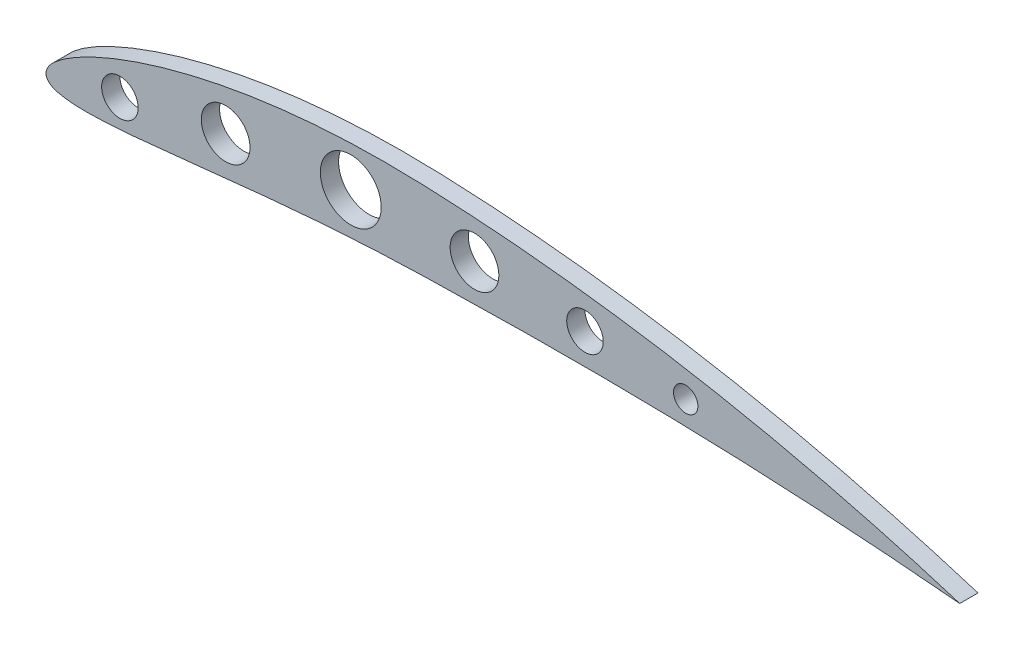
ISO-10303-21;
HEADER;
FILE_DESCRIPTION(('STEP AP214'),'2;1');
FILE_NAME('part.step','',(''),(''),'','','');
FILE_SCHEMA(('AUTOMOTIVE_DESIGN { 1 0 10303 214 1 1 1 1 }'));
ENDSEC;
DATA;
#1=APPLICATION_CONTEXT('core data for automotive mechanical design processes');
#2=APPLICATION_PROTOCOL_DEFINITION('international standard','automotive_design',2000,#1);
#3=PRODUCT_CONTEXT('',#1,'mechanical');
#4=PRODUCT('Part','Part','',(#3));
#5=PRODUCT_RELATED_PRODUCT_CATEGORY('part','',(#4));
#6=PRODUCT_DEFINITION_FORMATION('','',#4);
#7=PRODUCT_DEFINITION_CONTEXT('part definition',#1,'design');
#8=PRODUCT_DEFINITION('design','',#6,#7);
#9=PRODUCT_DEFINITION_SHAPE('','',#8);
#10=(LENGTH_UNIT() NAMED_UNIT(*) SI_UNIT(.MILLI.,.METRE.));
#11=(NAMED_UNIT(*) PLANE_ANGLE_UNIT() SI_UNIT($,.RADIAN.));
#12=(NAMED_UNIT(*) SI_UNIT($,.STERADIAN.) SOLID_ANGLE_UNIT());
#13=UNCERTAINTY_MEASURE_WITH_UNIT(LENGTH_MEASURE(1.E-05),#10,'distance_accuracy_value','');
#14=(GEOMETRIC_REPRESENTATION_CONTEXT(3) GLOBAL_UNCERTAINTY_ASSIGNED_CONTEXT((#13)) GLOBAL_UNIT_ASSIGNED_CONTEXT((#10,
#11,#12)) REPRESENTATION_CONTEXT('',''));
#15=CARTESIAN_POINT('',(0.,0.,0.));
#16=DIRECTION('',(0.,0.,1.));
#17=DIRECTION('',(1.,0.,0.));
#18=AXIS2_PLACEMENT_3D('',#15,#16,#17);
#19=CARTESIAN_POINT('',(0.868655213262158,2.19089135194776,3.));
#20=DIRECTION('',(0.,0.,-1.));
#21=DIRECTION('',(-1.,0.,0.));
#22=AXIS2_PLACEMENT_3D('',#19,#20,#21);
#23=PLANE('',#22);
#24=CARTESIAN_POINT('',(150.,0.,3.));
#25=CARTESIAN_POINT('',(150.003329288098,0.014662249381793,3.));
#26=CARTESIAN_POINT('',(149.134973150672,0.248896496606749,3.));
#27=CARTESIAN_POINT('',(148.258218064726,0.55673636161131,3.));
#28=CARTESIAN_POINT('',(146.092264589263,1.19654633017886,3.));
#29=CARTESIAN_POINT('',(143.419462383613,1.99778912742205,3.));
#30=CARTESIAN_POINT('',(139.8973824949,3.00503852710572,3.));
#31=CARTESIAN_POINT('',(135.708200057128,4.15404129208978,3.));
#32=CARTESIAN_POINT('',(130.840351884607,5.42023236841713,3.));
#33=CARTESIAN_POINT('',(125.358407530837,6.75391320255883,3.));
#34=CARTESIAN_POINT('',(119.317026459778,8.12073918287746,3.));
#35=CARTESIAN_POINT('',(112.776533721808,9.47315641929216,3.));
#36=CARTESIAN_POINT('',(105.8081891408,10.7735530552266,3.));
#37=CARTESIAN_POINT('',(98.4852742353414,11.9821183236793,3.));
#38=CARTESIAN_POINT('',(90.8867289870229,13.0634556553686,3.));
#39=CARTESIAN_POINT('',(83.0963164113784,13.987889126777,3.));
#40=CARTESIAN_POINT('',(75.2008775632585,14.7296564652224,3.));
#41=CARTESIAN_POINT('',(67.2867045416149,15.2583026600307,3.));
#42=CARTESIAN_POINT('',(59.4020917517364,15.5949352264237,3.));
#43=CARTESIAN_POINT('',(51.630745923189,15.5985104910385,3.));
#44=CARTESIAN_POINT('',(44.0772108290214,15.1999156905343,3.));
#45=CARTESIAN_POINT('',(36.8788402768822,14.4541881360431,3.));
#46=CARTESIAN_POINT('',(30.1283124778648,13.3973016279451,3.));
#47=CARTESIAN_POINT('',(23.9108028217145,12.0836838142789,3.));
#48=CARTESIAN_POINT('',(18.3002624953933,10.5812507246044,3.));
#49=CARTESIAN_POINT('',(13.3638162704224,8.95525486581491,3.));
#50=CARTESIAN_POINT('',(9.15203164401697,7.28566296549237,3.));
#51=CARTESIAN_POINT('',(5.71179711056867,5.62797186627232,3.));
#52=CARTESIAN_POINT('',(3.05382609046227,4.06651589033411,3.));
#53=CARTESIAN_POINT('',(1.21164919063601,2.6132969274779,3.));
#54=CARTESIAN_POINT('',(0.085052112339767,1.33763685976724,3.));
#55=CARTESIAN_POINT('',(-0.180458674317127,-0.0525224950474071,3.));
#56=CARTESIAN_POINT('',(0.796524923320563,-1.07046827432894,3.));
#57=CARTESIAN_POINT('',(2.41295725296556,-1.53139163258686,3.));
#58=CARTESIAN_POINT('',(4.69512828229199,-1.80071088142852,3.));
#59=CARTESIAN_POINT('',(7.68815207852203,-1.81332682765504,3.));
#60=CARTESIAN_POINT('',(11.3620652219487,-1.62868851947792,3.));
#61=CARTESIAN_POINT('',(15.6799913776274,-1.26019933249983,3.));
#62=CARTESIAN_POINT('',(20.592376906984,-0.755998832845897,3.));
#63=CARTESIAN_POINT('',(26.0492057680031,-0.159719017170101,3.));
#64=CARTESIAN_POINT('',(31.9923782717827,0.483630714989271,3.));
#65=CARTESIAN_POINT('',(38.3681705496154,1.12082265392437,3.));
#66=CARTESIAN_POINT('',(45.1151729753294,1.69616204750979,3.));
#67=CARTESIAN_POINT('',(52.1753974691805,2.17132127896637,3.));
#68=CARTESIAN_POINT('',(59.5252685150396,2.4861103560316,3.));
#69=CARTESIAN_POINT('',(67.096034109242,2.66254785129545,3.));
#70=CARTESIAN_POINT('',(74.8069470177635,2.81955224948347,3.));
#71=CARTESIAN_POINT('',(82.5372963529707,2.89928914122949,3.));
#72=CARTESIAN_POINT('',(90.2001718911497,2.9073914753727,3.));
#73=CARTESIAN_POINT('',(97.7131039294619,2.83440001624777,3.));
#74=CARTESIAN_POINT('',(104.993995582754,2.68571683811821,3.));
#75=CARTESIAN_POINT('',(111.962787733179,2.46721579099941,3.));
#76=CARTESIAN_POINT('',(118.541868922386,2.19416658208878,3.));
#77=CARTESIAN_POINT('',(124.65666734329,1.87970597556436,3.));
#78=CARTESIAN_POINT('',(130.234494892084,1.5455926932117,3.));
#79=CARTESIAN_POINT('',(135.216199769319,1.20653216079122,3.));
#80=CARTESIAN_POINT('',(139.523505248161,0.887469492673937,3.));
#81=CARTESIAN_POINT('',(143.160651508115,0.594190169675158,3.));
#82=CARTESIAN_POINT('',(145.933395979494,0.365370935003347,3.));
#83=CARTESIAN_POINT('',(148.178013553918,0.152677435659765,3.));
#84=CARTESIAN_POINT('',(149.106467306683,0.10166923520628,3.));
#85=CARTESIAN_POINT('',(149.996691266853,-0.0145717249786521,3.));
#86=CARTESIAN_POINT('',(150.,0.,3.));
#87=B_SPLINE_CURVE_WITH_KNOTS('',3,(#24,#25,#26,#27,#28,#29,#30,#31,#32,#33,#34,#35,#36,#37,#38,
#39,#40,#41,#42,#43,#44,#45,#46,#47,#48,#49,#50,#51,#52,#53,#54,#55,#56,#57,#58,#59,#60,#61,#62,
#63,#64,#65,#66,#67,#68,#69,#70,#71,#72,#73,#74,#75,#76,#77,#78,#79,#80,#81,#82,#83,#84,#85,
#86),.UNSPECIFIED.,.T.,.F.,(4,1,1,1,1,1,1,1,1,1,1,1,1,1,1,1,1,1,1,1,1,1,1,1,1,1,1,1,1,1,1,1,1,1,
1,1,1,1,1,1,1,1,1,1,1,1,1,1,1,1,1,1,1,1,1,1,1,1,1,1,4),(0.,0.00137455348322322,
0.00548449728179397,0.0122733609908926,0.021682195504866,0.0335806119079947,0.0478307427867091,
0.0643059527211733,0.082777332043007,0.103063756455996,0.124929016786915,0.148149110667858,
0.172444694611559,0.197572105868171,0.223268880537162,0.249227774933554,0.275186209349679,
0.300900708934774,0.326462938278696,0.351222485186767,0.374905858971967,0.397269706218862,
0.418072413969665,0.437079533175026,0.454093093767394,0.468919631578705,0.48139171235289,
0.491447126518174,0.499023571234558,0.504293734329401,0.507921918342,0.511539686153778,
0.516780527527172,0.524216490268905,0.533991629403711,0.546033957270731,0.560220284382465,
0.576403357410148,0.594370816485922,0.613951103581465,0.634916884969972,0.657088503485649,
0.680229909573905,0.704175481107386,0.729090367406641,0.754353775526936,0.779667752347888,
0.804760119952374,0.829359338708985,0.853208710008459,0.876041363199166,0.897604065496152,
0.917662212410958,0.935969860405553,0.952309787739252,0.966502759006892,0.978350082728452,
0.987731492337842,0.994510920242662,0.998633932979557,1.),.UNSPECIFIED.);
#88=CARTESIAN_POINT('',(150.,0.,3.));
#89=VERTEX_POINT('',#88);
#90=EDGE_CURVE('E11',#89,#89,#87,.T.);
#91=ORIENTED_EDGE('',*,*,#90,.T.);
#92=EDGE_LOOP('',(#91));
#93=FACE_BOUND('',#92,.T.);
#94=CARTESIAN_POINT('',(50.,8.83483874764579,3.));
#95=DIRECTION('',(0.,0.,1.));
#96=DIRECTION('',(1.,0.,0.));
#97=AXIS2_PLACEMENT_3D('',#94,#95,#96);
#98=CIRCLE('',#97,5.);
#99=CARTESIAN_POINT('',(55.,8.83483874764579,3.));
#100=VERTEX_POINT('',#99);
#101=EDGE_CURVE('E53',#100,#100,#98,.T.);
#102=ORIENTED_EDGE('',*,*,#101,.F.);
#103=EDGE_LOOP('',(#102));
#104=FACE_BOUND('',#103,.T.);
#105=CARTESIAN_POINT('',(105.,6.55662819325187,3.));
#106=DIRECTION('',(0.,0.,1.));
#107=DIRECTION('',(1.,0.,0.));
#108=AXIS2_PLACEMENT_3D('',#105,#106,#107);
#109=CIRCLE('',#108,2.);
#110=CARTESIAN_POINT('',(107.,6.55662819325187,3.));
#111=VERTEX_POINT('',#110);
#112=EDGE_CURVE('E76',#111,#111,#109,.T.);
#113=ORIENTED_EDGE('',*,*,#112,.F.);
#114=EDGE_LOOP('',(#113));
#115=FACE_BOUND('',#114,.T.);
#116=CARTESIAN_POINT('',(70.3168159356622,8.83483874764579,3.));
#117=DIRECTION('',(0.,0.,1.));
#118=DIRECTION('',(1.,0.,0.));
#119=AXIS2_PLACEMENT_3D('',#116,#117,#118);
#120=CIRCLE('',#119,4.00000000000001);
#121=CARTESIAN_POINT('',(74.3168159356622,8.83483874764579,3.));
#122=VERTEX_POINT('',#121);
#123=EDGE_CURVE('E77',#122,#122,#120,.T.);
#124=ORIENTED_EDGE('',*,*,#123,.F.);
#125=EDGE_LOOP('',(#124));
#126=FACE_BOUND('',#125,.T.);
#127=CARTESIAN_POINT('',(29.4551005586143,6.55662819325187,3.));
#128=DIRECTION('',(0.,0.,1.));
#129=DIRECTION('',(1.,0.,0.));
#130=AXIS2_PLACEMENT_3D('',#127,#128,#129);
#131=CIRCLE('',#130,4.);
#132=CARTESIAN_POINT('',(33.4551005586143,6.55662819325187,3.));
#133=VERTEX_POINT('',#132);
#134=EDGE_CURVE('E86',#133,#133,#131,.T.);
#135=ORIENTED_EDGE('',*,*,#134,.F.);
#136=EDGE_LOOP('',(#135));
#137=FACE_BOUND('',#136,.T.);
#138=CARTESIAN_POINT('',(12.0879348632954,3.04049328422451,3.));
#139=DIRECTION('',(0.,0.,1.));
#140=DIRECTION('',(1.,0.,0.));
#141=AXIS2_PLACEMENT_3D('',#138,#139,#140);
#142=CIRCLE('',#141,3.);
#143=CARTESIAN_POINT('',(15.0879348632954,3.04049328422451,3.));
#144=VERTEX_POINT('',#143);
#145=EDGE_CURVE('E102',#144,#144,#142,.T.);
#146=ORIENTED_EDGE('',*,*,#145,.F.);
#147=EDGE_LOOP('',(#146));
#148=FACE_BOUND('',#147,.T.);
#149=CARTESIAN_POINT('',(88.4595854656354,7.95328440218412,3.));
#150=DIRECTION('',(0.,0.,1.));
#151=DIRECTION('',(1.,0.,0.));
#152=AXIS2_PLACEMENT_3D('',#149,#150,#151);
#153=CIRCLE('',#152,3.00000000000001);
#154=CARTESIAN_POINT('',(91.4595854656354,7.95328440218412,3.));
#155=VERTEX_POINT('',#154);
#156=EDGE_CURVE('E103',#155,#155,#153,.T.);
#157=ORIENTED_EDGE('',*,*,#156,.F.);
#158=EDGE_LOOP('',(#157));
#159=FACE_BOUND('',#158,.T.);
#160=ADVANCED_FACE('F38',(#93,#104,#115,#126,#137,#148,#159),#23,.F.);
#161=CARTESIAN_POINT('',(0.868655213262158,2.19089135194776,0.));
#162=DIRECTION('',(0.,0.,-1.));
#163=DIRECTION('',(-1.,0.,0.));
#164=AXIS2_PLACEMENT_3D('',#161,#162,#163);
#165=PLANE('',#164);
#166=CARTESIAN_POINT('',(12.0879348632954,3.04049328422451,0.));
#167=DIRECTION('',(0.,0.,1.));
#168=DIRECTION('',(1.,0.,0.));
#169=AXIS2_PLACEMENT_3D('',#166,#167,#168);
#170=CIRCLE('',#169,3.);
#171=CARTESIAN_POINT('',(15.0879348632954,3.04049328422451,0.));
#172=VERTEX_POINT('',#171);
#173=EDGE_CURVE('E99',#172,#172,#170,.T.);
#174=ORIENTED_EDGE('',*,*,#173,.T.);
#175=EDGE_LOOP('',(#174));
#176=FACE_BOUND('',#175,.T.);
#177=CARTESIAN_POINT('',(70.3168159356622,8.83483874764579,0.));
#178=DIRECTION('',(0.,0.,1.));
#179=DIRECTION('',(1.,0.,0.));
#180=AXIS2_PLACEMENT_3D('',#177,#178,#179);
#181=CIRCLE('',#180,4.00000000000001);
#182=CARTESIAN_POINT('',(74.3168159356622,8.83483874764579,0.));
#183=VERTEX_POINT('',#182);
#184=EDGE_CURVE('E82',#183,#183,#181,.T.);
#185=ORIENTED_EDGE('',*,*,#184,.T.);
#186=EDGE_LOOP('',(#185));
#187=FACE_BOUND('',#186,.T.);
#188=CARTESIAN_POINT('',(50.,8.83483874764579,0.));
#189=DIRECTION('',(0.,0.,1.));
#190=DIRECTION('',(1.,0.,0.));
#191=AXIS2_PLACEMENT_3D('',#188,#189,#190);
#192=CIRCLE('',#191,5.);
#193=CARTESIAN_POINT('',(55.,8.83483874764579,0.));
#194=VERTEX_POINT('',#193);
#195=EDGE_CURVE('E58',#194,#194,#192,.T.);
#196=ORIENTED_EDGE('',*,*,#195,.T.);
#197=EDGE_LOOP('',(#196));
#198=FACE_BOUND('',#197,.T.);
#199=CARTESIAN_POINT('',(150.,0.,0.));
#200=CARTESIAN_POINT('',(150.003329288098,0.014662249381793,0.));
#201=CARTESIAN_POINT('',(149.134973150672,0.248896496606749,0.));
#202=CARTESIAN_POINT('',(148.258218064726,0.55673636161131,0.));
#203=CARTESIAN_POINT('',(146.092264589263,1.19654633017886,0.));
#204=CARTESIAN_POINT('',(143.419462383613,1.99778912742205,0.));
#205=CARTESIAN_POINT('',(139.8973824949,3.00503852710572,0.));
#206=CARTESIAN_POINT('',(135.708200057128,4.15404129208978,0.));
#207=CARTESIAN_POINT('',(130.840351884607,5.42023236841713,0.));
#208=CARTESIAN_POINT('',(125.358407530837,6.75391320255883,0.));
#209=CARTESIAN_POINT('',(119.317026459778,8.12073918287746,0.));
#210=CARTESIAN_POINT('',(112.776533721808,9.47315641929216,0.));
#211=CARTESIAN_POINT('',(105.8081891408,10.7735530552266,0.));
#212=CARTESIAN_POINT('',(98.4852742353414,11.9821183236793,0.));
#213=CARTESIAN_POINT('',(90.8867289870229,13.0634556553686,0.));
#214=CARTESIAN_POINT('',(83.0963164113784,13.987889126777,0.));
#215=CARTESIAN_POINT('',(75.2008775632585,14.7296564652224,0.));
#216=CARTESIAN_POINT('',(67.2867045416149,15.2583026600307,0.));
#217=CARTESIAN_POINT('',(59.4020917517364,15.5949352264237,0.));
#218=CARTESIAN_POINT('',(51.630745923189,15.5985104910385,0.));
#219=CARTESIAN_POINT('',(44.0772108290214,15.1999156905343,0.));
#220=CARTESIAN_POINT('',(36.8788402768822,14.4541881360431,0.));
#221=CARTESIAN_POINT('',(30.1283124778648,13.3973016279451,0.));
#222=CARTESIAN_POINT('',(23.9108028217145,12.0836838142789,0.));
#223=CARTESIAN_POINT('',(18.3002624953933,10.5812507246044,0.));
#224=CARTESIAN_POINT('',(13.3638162704224,8.95525486581491,0.));
#225=CARTESIAN_POINT('',(9.15203164401697,7.28566296549237,0.));
#226=CARTESIAN_POINT('',(5.71179711056867,5.62797186627232,0.));
#227=CARTESIAN_POINT('',(3.05382609046227,4.06651589033411,0.));
#228=CARTESIAN_POINT('',(1.21164919063601,2.6132969274779,0.));
#229=CARTESIAN_POINT('',(0.085052112339767,1.33763685976724,0.));
#230=CARTESIAN_POINT('',(-0.180458674317127,-0.0525224950474071,0.));
#231=CARTESIAN_POINT('',(0.796524923320563,-1.07046827432894,0.));
#232=CARTESIAN_POINT('',(2.41295725296556,-1.53139163258686,0.));
#233=CARTESIAN_POINT('',(4.69512828229199,-1.80071088142852,0.));
#234=CARTESIAN_POINT('',(7.68815207852203,-1.81332682765504,0.));
#235=CARTESIAN_POINT('',(11.3620652219487,-1.62868851947792,0.));
#236=CARTESIAN_POINT('',(15.6799913776274,-1.26019933249983,0.));
#237=CARTESIAN_POINT('',(20.592376906984,-0.755998832845897,0.));
#238=CARTESIAN_POINT('',(26.0492057680031,-0.159719017170101,0.));
#239=CARTESIAN_POINT('',(31.9923782717827,0.483630714989271,0.));
#240=CARTESIAN_POINT('',(38.3681705496154,1.12082265392437,0.));
#241=CARTESIAN_POINT('',(45.1151729753294,1.69616204750979,0.));
#242=CARTESIAN_POINT('',(52.1753974691805,2.17132127896637,0.));
#243=CARTESIAN_POINT('',(59.5252685150396,2.4861103560316,0.));
#244=CARTESIAN_POINT('',(67.096034109242,2.66254785129545,0.));
#245=CARTESIAN_POINT('',(74.8069470177635,2.81955224948347,0.));
#246=CARTESIAN_POINT('',(82.5372963529707,2.89928914122949,0.));
#247=CARTESIAN_POINT('',(90.2001718911497,2.9073914753727,0.));
#248=CARTESIAN_POINT('',(97.7131039294619,2.83440001624777,0.));
#249=CARTESIAN_POINT('',(104.993995582754,2.68571683811821,0.));
#250=CARTESIAN_POINT('',(111.962787733179,2.46721579099941,0.));
#251=CARTESIAN_POINT('',(118.541868922386,2.19416658208878,0.));
#252=CARTESIAN_POINT('',(124.65666734329,1.87970597556436,0.));
#253=CARTESIAN_POINT('',(130.234494892084,1.5455926932117,0.));
#254=CARTESIAN_POINT('',(135.216199769319,1.20653216079122,0.));
#255=CARTESIAN_POINT('',(139.523505248161,0.887469492673937,0.));
#256=CARTESIAN_POINT('',(143.160651508115,0.594190169675158,0.));
#257=CARTESIAN_POINT('',(145.933395979494,0.365370935003347,0.));
#258=CARTESIAN_POINT('',(148.178013553918,0.152677435659765,0.));
#259=CARTESIAN_POINT('',(149.106467306683,0.10166923520628,0.));
#260=CARTESIAN_POINT('',(149.996691266853,-0.0145717249786521,0.));
#261=CARTESIAN_POINT('',(150.,0.,0.));
#262=B_SPLINE_CURVE_WITH_KNOTS('',3,(#199,#200,#201,#202,#203,#204,#205,#206,#207,#208,#209,
#210,#211,#212,#213,#214,#215,#216,#217,#218,#219,#220,#221,#222,#223,#224,#225,#226,#227,#228,
#229,#230,#231,#232,#233,#234,#235,#236,#237,#238,#239,#240,#241,#242,#243,#244,#245,#246,#247,
#248,#249,#250,#251,#252,#253,#254,#255,#256,#257,#258,#259,#260,#261),.UNSPECIFIED.,.T.,.F.,(4,
1,1,1,1,1,1,1,1,1,1,1,1,1,1,1,1,1,1,1,1,1,1,1,1,1,1,1,1,1,1,1,1,1,1,1,1,1,1,1,1,1,1,1,1,1,1,1,1,
1,1,1,1,1,1,1,1,1,1,1,4),(0.,0.00137455348322322,0.00548449728179397,0.0122733609908926,
0.021682195504866,0.0335806119079947,0.0478307427867091,0.0643059527211733,0.082777332043007,
0.103063756455996,0.124929016786915,0.148149110667858,0.172444694611559,0.197572105868171,
0.223268880537162,0.249227774933554,0.275186209349679,0.300900708934774,0.326462938278696,
0.351222485186767,0.374905858971967,0.397269706218862,0.418072413969665,0.437079533175026,
0.454093093767394,0.468919631578705,0.48139171235289,0.491447126518174,0.499023571234558,
0.504293734329401,0.507921918342,0.511539686153778,0.516780527527172,0.524216490268905,
0.533991629403711,0.546033957270731,0.560220284382465,0.576403357410148,0.594370816485922,
0.613951103581465,0.634916884969972,0.657088503485649,0.680229909573905,0.704175481107386,
0.729090367406641,0.754353775526936,0.779667752347888,0.804760119952374,0.829359338708985,
0.853208710008459,0.876041363199166,0.897604065496152,0.917662212410958,0.935969860405553,
0.952309787739252,0.966502759006892,0.978350082728452,0.987731492337842,0.994510920242662,
0.998633932979557,1.),.UNSPECIFIED.);
#263=CARTESIAN_POINT('',(150.,0.,0.));
#264=VERTEX_POINT('',#263);
#265=EDGE_CURVE('E43',#264,#264,#262,.T.);
#266=ORIENTED_EDGE('',*,*,#265,.F.);
#267=EDGE_LOOP('',(#266));
#268=FACE_BOUND('',#267,.T.);
#269=CARTESIAN_POINT('',(105.,6.55662819325187,0.));
#270=DIRECTION('',(0.,0.,1.));
#271=DIRECTION('',(1.,0.,0.));
#272=AXIS2_PLACEMENT_3D('',#269,#270,#271);
#273=CIRCLE('',#272,2.);
#274=CARTESIAN_POINT('',(107.,6.55662819325187,0.));
#275=VERTEX_POINT('',#274);
#276=EDGE_CURVE('E73',#275,#275,#273,.T.);
#277=ORIENTED_EDGE('',*,*,#276,.T.);
#278=EDGE_LOOP('',(#277));
#279=FACE_BOUND('',#278,.T.);
#280=CARTESIAN_POINT('',(29.4551005586143,6.55662819325187,0.));
#281=DIRECTION('',(0.,0.,1.));
#282=DIRECTION('',(1.,0.,0.));
#283=AXIS2_PLACEMENT_3D('',#280,#281,#282);
#284=CIRCLE('',#283,4.);
#285=CARTESIAN_POINT('',(33.4551005586143,6.55662819325187,0.));
#286=VERTEX_POINT('',#285);
#287=EDGE_CURVE('E91',#286,#286,#284,.T.);
#288=ORIENTED_EDGE('',*,*,#287,.T.);
#289=EDGE_LOOP('',(#288));
#290=FACE_BOUND('',#289,.T.);
#291=CARTESIAN_POINT('',(88.4595854656354,7.95328440218412,0.));
#292=DIRECTION('',(0.,0.,1.));
#293=DIRECTION('',(1.,0.,0.));
#294=AXIS2_PLACEMENT_3D('',#291,#292,#293);
#295=CIRCLE('',#294,3.00000000000001);
#296=CARTESIAN_POINT('',(91.4595854656354,7.95328440218412,0.));
#297=VERTEX_POINT('',#296);
#298=EDGE_CURVE('E108',#297,#297,#295,.T.);
#299=ORIENTED_EDGE('',*,*,#298,.T.);
#300=EDGE_LOOP('',(#299));
#301=FACE_BOUND('',#300,.T.);
#302=ADVANCED_FACE('F120',(#176,#187,#198,#268,#279,#290,#301),#165,.T.);
#303=DIRECTION('',(0.,0.,-1.));
#304=VECTOR('',#303,1.);
#305=SURFACE_OF_LINEAR_EXTRUSION('',#87,#304);
#306=ORIENTED_EDGE('',*,*,#90,.F.);
#307=EDGE_LOOP('',(#306));
#308=FACE_BOUND('',#307,.T.);
#309=ORIENTED_EDGE('',*,*,#265,.T.);
#310=EDGE_LOOP('',(#309));
#311=FACE_BOUND('',#310,.T.);
#312=ADVANCED_FACE('F40',(#308,#311),#305,.F.);
#313=CARTESIAN_POINT('',(50.,8.83483874764579,3.));
#314=DIRECTION('',(0.,0.,-1.));
#315=DIRECTION('',(-1.,0.,0.));
#316=AXIS2_PLACEMENT_3D('',#313,#314,#315);
#317=CYLINDRICAL_SURFACE('',#316,5.);
#318=ORIENTED_EDGE('',*,*,#101,.T.);
#319=EDGE_LOOP('',(#318));
#320=FACE_BOUND('',#319,.T.);
#321=ORIENTED_EDGE('',*,*,#195,.F.);
#322=EDGE_LOOP('',(#321));
#323=FACE_BOUND('',#322,.T.);
#324=ADVANCED_FACE('F128',(#320,#323),#317,.F.);
#325=CARTESIAN_POINT('',(105.,6.55662819325187,3.));
#326=DIRECTION('',(0.,0.,-1.));
#327=DIRECTION('',(-1.,0.,0.));
#328=AXIS2_PLACEMENT_3D('',#325,#326,#327);
#329=CYLINDRICAL_SURFACE('',#328,2.);
#330=ORIENTED_EDGE('',*,*,#112,.T.);
#331=EDGE_LOOP('',(#330));
#332=FACE_BOUND('',#331,.T.);
#333=ORIENTED_EDGE('',*,*,#276,.F.);
#334=EDGE_LOOP('',(#333));
#335=FACE_BOUND('',#334,.T.);
#336=ADVANCED_FACE('F131',(#332,#335),#329,.F.);
#337=CARTESIAN_POINT('',(70.3168159356622,8.83483874764579,3.));
#338=DIRECTION('',(0.,0.,-1.));
#339=DIRECTION('',(-1.,0.,0.));
#340=AXIS2_PLACEMENT_3D('',#337,#338,#339);
#341=CYLINDRICAL_SURFACE('',#340,4.00000000000001);
#342=ORIENTED_EDGE('',*,*,#123,.T.);
#343=EDGE_LOOP('',(#342));
#344=FACE_BOUND('',#343,.T.);
#345=ORIENTED_EDGE('',*,*,#184,.F.);
#346=EDGE_LOOP('',(#345));
#347=FACE_BOUND('',#346,.T.);
#348=ADVANCED_FACE('F135',(#344,#347),#341,.F.);
#349=CARTESIAN_POINT('',(29.4551005586143,6.55662819325187,3.));
#350=DIRECTION('',(0.,0.,-1.));
#351=DIRECTION('',(-1.,0.,0.));
#352=AXIS2_PLACEMENT_3D('',#349,#350,#351);
#353=CYLINDRICAL_SURFACE('',#352,4.);
#354=ORIENTED_EDGE('',*,*,#134,.T.);
#355=EDGE_LOOP('',(#354));
#356=FACE_BOUND('',#355,.T.);
#357=ORIENTED_EDGE('',*,*,#287,.F.);
#358=EDGE_LOOP('',(#357));
#359=FACE_BOUND('',#358,.T.);
#360=ADVANCED_FACE('F139',(#356,#359),#353,.F.);
#361=CARTESIAN_POINT('',(12.0879348632954,3.04049328422451,3.));
#362=DIRECTION('',(0.,0.,-1.));
#363=DIRECTION('',(-1.,0.,0.));
#364=AXIS2_PLACEMENT_3D('',#361,#362,#363);
#365=CYLINDRICAL_SURFACE('',#364,3.);
#366=ORIENTED_EDGE('',*,*,#145,.T.);
#367=EDGE_LOOP('',(#366));
#368=FACE_BOUND('',#367,.T.);
#369=ORIENTED_EDGE('',*,*,#173,.F.);
#370=EDGE_LOOP('',(#369));
#371=FACE_BOUND('',#370,.T.);
#372=ADVANCED_FACE('F143',(#368,#371),#365,.F.);
#373=CARTESIAN_POINT('',(88.4595854656354,7.95328440218412,3.));
#374=DIRECTION('',(0.,0.,-1.));
#375=DIRECTION('',(-1.,0.,0.));
#376=AXIS2_PLACEMENT_3D('',#373,#374,#375);
#377=CYLINDRICAL_SURFACE('',#376,3.00000000000001);
#378=ORIENTED_EDGE('',*,*,#156,.T.);
#379=EDGE_LOOP('',(#378));
#380=FACE_BOUND('',#379,.T.);
#381=ORIENTED_EDGE('',*,*,#298,.F.);
#382=EDGE_LOOP('',(#381));
#383=FACE_BOUND('',#382,.T.);
#384=ADVANCED_FACE('F116',(#380,#383),#377,.F.);
#385=CLOSED_SHELL('',(#160,#302,#312,#324,#336,#348,#360,#372,#384));
#386=MANIFOLD_SOLID_BREP('B2',#385);
#387=ADVANCED_BREP_SHAPE_REPRESENTATION('',(#18,#386),#14);
#388=SHAPE_DEFINITION_REPRESENTATION(#9,#387);
ENDSEC;
END-ISO-10303-21;
